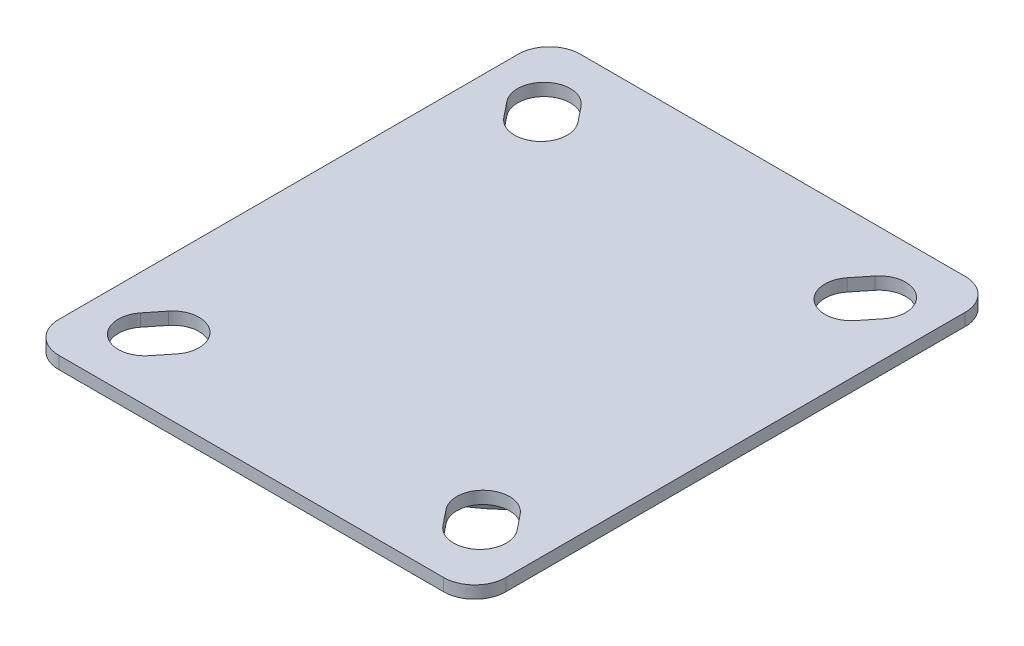
ISO-10303-21;
HEADER;
FILE_DESCRIPTION(('STEP AP214'),'2;1');
FILE_NAME('part.step','',(''),(''),'','','');
FILE_SCHEMA(('AUTOMOTIVE_DESIGN { 1 0 10303 214 1 1 1 1 }'));
ENDSEC;
DATA;
#1=APPLICATION_CONTEXT('core data for automotive mechanical design processes');
#2=APPLICATION_PROTOCOL_DEFINITION('international standard','automotive_design',2000,#1);
#3=PRODUCT_CONTEXT('',#1,'mechanical');
#4=PRODUCT('Part','Part','',(#3));
#5=PRODUCT_RELATED_PRODUCT_CATEGORY('part','',(#4));
#6=PRODUCT_DEFINITION_FORMATION('','',#4);
#7=PRODUCT_DEFINITION_CONTEXT('part definition',#1,'design');
#8=PRODUCT_DEFINITION('design','',#6,#7);
#9=PRODUCT_DEFINITION_SHAPE('','',#8);
#10=(LENGTH_UNIT() NAMED_UNIT(*) SI_UNIT(.MILLI.,.METRE.));
#11=(NAMED_UNIT(*) PLANE_ANGLE_UNIT() SI_UNIT($,.RADIAN.));
#12=(NAMED_UNIT(*) SI_UNIT($,.STERADIAN.) SOLID_ANGLE_UNIT());
#13=UNCERTAINTY_MEASURE_WITH_UNIT(LENGTH_MEASURE(1.E-05),#10,'distance_accuracy_value','');
#14=(GEOMETRIC_REPRESENTATION_CONTEXT(3) GLOBAL_UNCERTAINTY_ASSIGNED_CONTEXT((#13)) GLOBAL_UNIT_ASSIGNED_CONTEXT((#10,
#11,#12)) REPRESENTATION_CONTEXT('',''));
#15=CARTESIAN_POINT('',(0.,0.,0.));
#16=DIRECTION('',(0.,0.,1.));
#17=DIRECTION('',(1.,0.,0.));
#18=AXIS2_PLACEMENT_3D('',#15,#16,#17);
#19=CARTESIAN_POINT('',(31.0000000000009,9.,37.0000000000009));
#20=DIRECTION('',(0.,1.,0.));
#21=DIRECTION('',(-0.707106781186548,0.,-0.707106781186547));
#22=AXIS2_PLACEMENT_3D('',#19,#20,#21);
#23=CYLINDRICAL_SURFACE('',#22,5.);
#24=CARTESIAN_POINT('',(31.0000000000009,7.,37.0000000000009));
#25=DIRECTION('',(0.,1.,0.));
#26=DIRECTION('',(1.,0.,0.));
#27=AXIS2_PLACEMENT_3D('',#24,#25,#26);
#28=CIRCLE('',#27,5.);
#29=CARTESIAN_POINT('',(31.,7.,42.));
#30=VERTEX_POINT('',#29);
#31=CARTESIAN_POINT('',(36.,7.,37.));
#32=VERTEX_POINT('',#31);
#33=EDGE_CURVE('E11',#30,#32,#28,.T.);
#34=ORIENTED_EDGE('',*,*,#33,.T.);
#35=DIRECTION('',(0.,-1.,0.));
#36=VECTOR('',#35,1.);
#37=CARTESIAN_POINT('',(36.,9.,37.));
#38=LINE('',#37,#36);
#39=CARTESIAN_POINT('',(36.,9.,37.));
#40=VERTEX_POINT('',#39);
#41=EDGE_CURVE('E25',#40,#32,#38,.T.);
#42=ORIENTED_EDGE('',*,*,#41,.F.);
#43=CARTESIAN_POINT('',(31.0000000000009,9.,37.0000000000009));
#44=DIRECTION('',(0.,1.,0.));
#45=DIRECTION('',(1.,0.,0.));
#46=AXIS2_PLACEMENT_3D('',#43,#44,#45);
#47=CIRCLE('',#46,5.);
#48=CARTESIAN_POINT('',(31.,9.,42.));
#49=VERTEX_POINT('',#48);
#50=EDGE_CURVE('E538',#49,#40,#47,.T.);
#51=ORIENTED_EDGE('',*,*,#50,.F.);
#52=DIRECTION('',(0.,-1.,0.));
#53=VECTOR('',#52,1.);
#54=CARTESIAN_POINT('',(31.,9.,42.));
#55=LINE('',#54,#53);
#56=EDGE_CURVE('E534',#49,#30,#55,.T.);
#57=ORIENTED_EDGE('',*,*,#56,.T.);
#58=EDGE_LOOP('',(#34,#42,#51,#57));
#59=FACE_BOUND('',#58,.T.);
#60=ADVANCED_FACE('F17',(#59),#23,.T.);
#61=CARTESIAN_POINT('',(-31.,9.,42.));
#62=DIRECTION('',(0.,0.,-1.));
#63=DIRECTION('',(-1.,0.,0.));
#64=AXIS2_PLACEMENT_3D('',#61,#62,#63);
#65=PLANE('',#64);
#66=DIRECTION('',(1.,0.,0.));
#67=VECTOR('',#66,1.);
#68=CARTESIAN_POINT('',(-31.,7.,42.));
#69=LINE('',#68,#67);
#70=CARTESIAN_POINT('',(-31.,7.,42.));
#71=VERTEX_POINT('',#70);
#72=EDGE_CURVE('E529',#71,#30,#69,.T.);
#73=ORIENTED_EDGE('',*,*,#72,.T.);
#74=ORIENTED_EDGE('',*,*,#56,.F.);
#75=DIRECTION('',(1.,0.,0.));
#76=VECTOR('',#75,1.);
#77=CARTESIAN_POINT('',(-31.,9.,42.));
#78=LINE('',#77,#76);
#79=CARTESIAN_POINT('',(-31.,9.,42.));
#80=VERTEX_POINT('',#79);
#81=EDGE_CURVE('E524',#80,#49,#78,.T.);
#82=ORIENTED_EDGE('',*,*,#81,.F.);
#83=DIRECTION('',(0.,-1.,0.));
#84=VECTOR('',#83,1.);
#85=CARTESIAN_POINT('',(-31.,9.,42.));
#86=LINE('',#85,#84);
#87=EDGE_CURVE('E520',#80,#71,#86,.T.);
#88=ORIENTED_EDGE('',*,*,#87,.T.);
#89=EDGE_LOOP('',(#73,#74,#82,#88));
#90=FACE_BOUND('',#89,.T.);
#91=ADVANCED_FACE('F564',(#90),#65,.F.);
#92=CARTESIAN_POINT('',(-31.0000000000009,9.,37.0000000000009));
#93=DIRECTION('',(0.,1.,0.));
#94=DIRECTION('',(0.707106781186548,0.,-0.707106781186547));
#95=AXIS2_PLACEMENT_3D('',#92,#93,#94);
#96=CYLINDRICAL_SURFACE('',#95,5.);
#97=CARTESIAN_POINT('',(-31.0000000000009,7.,37.0000000000009));
#98=DIRECTION('',(0.,1.,0.));
#99=DIRECTION('',(1.,0.,0.));
#100=AXIS2_PLACEMENT_3D('',#97,#98,#99);
#101=CIRCLE('',#100,5.);
#102=CARTESIAN_POINT('',(-36.,7.,37.));
#103=VERTEX_POINT('',#102);
#104=EDGE_CURVE('E515',#103,#71,#101,.T.);
#105=ORIENTED_EDGE('',*,*,#104,.T.);
#106=ORIENTED_EDGE('',*,*,#87,.F.);
#107=CARTESIAN_POINT('',(-31.0000000000009,9.,37.0000000000009));
#108=DIRECTION('',(0.,1.,0.));
#109=DIRECTION('',(1.,0.,0.));
#110=AXIS2_PLACEMENT_3D('',#107,#108,#109);
#111=CIRCLE('',#110,5.);
#112=CARTESIAN_POINT('',(-36.,9.,37.));
#113=VERTEX_POINT('',#112);
#114=EDGE_CURVE('E510',#113,#80,#111,.T.);
#115=ORIENTED_EDGE('',*,*,#114,.F.);
#116=DIRECTION('',(0.,-1.,0.));
#117=VECTOR('',#116,1.);
#118=CARTESIAN_POINT('',(-36.,9.,37.));
#119=LINE('',#118,#117);
#120=EDGE_CURVE('E506',#113,#103,#119,.T.);
#121=ORIENTED_EDGE('',*,*,#120,.T.);
#122=EDGE_LOOP('',(#105,#106,#115,#121));
#123=FACE_BOUND('',#122,.T.);
#124=ADVANCED_FACE('F569',(#123),#96,.T.);
#125=CARTESIAN_POINT('',(-36.,9.,-37.));
#126=DIRECTION('',(1.,0.,0.));
#127=DIRECTION('',(0.,0.,-1.));
#128=AXIS2_PLACEMENT_3D('',#125,#126,#127);
#129=PLANE('',#128);
#130=DIRECTION('',(0.,0.,1.));
#131=VECTOR('',#130,1.);
#132=CARTESIAN_POINT('',(-36.,7.,-37.));
#133=LINE('',#132,#131);
#134=CARTESIAN_POINT('',(-36.,7.,-37.));
#135=VERTEX_POINT('',#134);
#136=EDGE_CURVE('E501',#135,#103,#133,.T.);
#137=ORIENTED_EDGE('',*,*,#136,.T.);
#138=ORIENTED_EDGE('',*,*,#120,.F.);
#139=DIRECTION('',(0.,0.,1.));
#140=VECTOR('',#139,1.);
#141=CARTESIAN_POINT('',(-36.,9.,-37.));
#142=LINE('',#141,#140);
#143=CARTESIAN_POINT('',(-36.,9.,-37.));
#144=VERTEX_POINT('',#143);
#145=EDGE_CURVE('E496',#144,#113,#142,.T.);
#146=ORIENTED_EDGE('',*,*,#145,.F.);
#147=DIRECTION('',(0.,-1.,0.));
#148=VECTOR('',#147,1.);
#149=CARTESIAN_POINT('',(-36.,9.,-37.));
#150=LINE('',#149,#148);
#151=EDGE_CURVE('E492',#144,#135,#150,.T.);
#152=ORIENTED_EDGE('',*,*,#151,.T.);
#153=EDGE_LOOP('',(#137,#138,#146,#152));
#154=FACE_BOUND('',#153,.T.);
#155=ADVANCED_FACE('F572',(#154),#129,.F.);
#156=CARTESIAN_POINT('',(-31.0000000000009,9.,-37.0000000000009));
#157=DIRECTION('',(0.,1.,0.));
#158=DIRECTION('',(0.707106781186675,0.,0.70710678118642));
#159=AXIS2_PLACEMENT_3D('',#156,#157,#158);
#160=CYLINDRICAL_SURFACE('',#159,5.);
#161=CARTESIAN_POINT('',(-31.0000000000009,7.,-37.0000000000009));
#162=DIRECTION('',(0.,1.,0.));
#163=DIRECTION('',(1.,0.,0.));
#164=AXIS2_PLACEMENT_3D('',#161,#162,#163);
#165=CIRCLE('',#164,5.);
#166=CARTESIAN_POINT('',(-31.,7.,-42.));
#167=VERTEX_POINT('',#166);
#168=EDGE_CURVE('E487',#167,#135,#165,.T.);
#169=ORIENTED_EDGE('',*,*,#168,.T.);
#170=ORIENTED_EDGE('',*,*,#151,.F.);
#171=CARTESIAN_POINT('',(-31.0000000000009,9.,-37.0000000000009));
#172=DIRECTION('',(0.,1.,0.));
#173=DIRECTION('',(1.,0.,0.));
#174=AXIS2_PLACEMENT_3D('',#171,#172,#173);
#175=CIRCLE('',#174,5.);
#176=CARTESIAN_POINT('',(-31.,9.,-42.));
#177=VERTEX_POINT('',#176);
#178=EDGE_CURVE('E482',#177,#144,#175,.T.);
#179=ORIENTED_EDGE('',*,*,#178,.F.);
#180=DIRECTION('',(0.,-1.,0.));
#181=VECTOR('',#180,1.);
#182=CARTESIAN_POINT('',(-31.,9.,-42.));
#183=LINE('',#182,#181);
#184=EDGE_CURVE('E478',#177,#167,#183,.T.);
#185=ORIENTED_EDGE('',*,*,#184,.T.);
#186=EDGE_LOOP('',(#169,#170,#179,#185));
#187=FACE_BOUND('',#186,.T.);
#188=ADVANCED_FACE('F575',(#187),#160,.T.);
#189=CARTESIAN_POINT('',(31.,9.,-42.));
#190=DIRECTION('',(0.,0.,1.));
#191=DIRECTION('',(1.,0.,0.));
#192=AXIS2_PLACEMENT_3D('',#189,#190,#191);
#193=PLANE('',#192);
#194=DIRECTION('',(-1.,0.,0.));
#195=VECTOR('',#194,1.);
#196=CARTESIAN_POINT('',(31.,7.,-42.));
#197=LINE('',#196,#195);
#198=CARTESIAN_POINT('',(31.,7.,-42.));
#199=VERTEX_POINT('',#198);
#200=EDGE_CURVE('E473',#199,#167,#197,.T.);
#201=ORIENTED_EDGE('',*,*,#200,.T.);
#202=ORIENTED_EDGE('',*,*,#184,.F.);
#203=DIRECTION('',(-1.,0.,0.));
#204=VECTOR('',#203,1.);
#205=CARTESIAN_POINT('',(31.,9.,-42.));
#206=LINE('',#205,#204);
#207=CARTESIAN_POINT('',(31.,9.,-42.));
#208=VERTEX_POINT('',#207);
#209=EDGE_CURVE('E468',#208,#177,#206,.T.);
#210=ORIENTED_EDGE('',*,*,#209,.F.);
#211=DIRECTION('',(0.,-1.,0.));
#212=VECTOR('',#211,1.);
#213=CARTESIAN_POINT('',(31.,9.,-42.));
#214=LINE('',#213,#212);
#215=EDGE_CURVE('E464',#208,#199,#214,.T.);
#216=ORIENTED_EDGE('',*,*,#215,.T.);
#217=EDGE_LOOP('',(#201,#202,#210,#216));
#218=FACE_BOUND('',#217,.T.);
#219=ADVANCED_FACE('F578',(#218),#193,.F.);
#220=CARTESIAN_POINT('',(31.0000000000009,9.,-37.0000000000009));
#221=DIRECTION('',(0.,1.,0.));
#222=DIRECTION('',(-0.707106781186548,0.,0.707106781186547));
#223=AXIS2_PLACEMENT_3D('',#220,#221,#222);
#224=CYLINDRICAL_SURFACE('',#223,5.);
#225=CARTESIAN_POINT('',(31.0000000000009,7.,-37.0000000000009));
#226=DIRECTION('',(0.,1.,0.));
#227=DIRECTION('',(1.,0.,0.));
#228=AXIS2_PLACEMENT_3D('',#225,#226,#227);
#229=CIRCLE('',#228,5.);
#230=CARTESIAN_POINT('',(36.,7.,-37.));
#231=VERTEX_POINT('',#230);
#232=EDGE_CURVE('E459',#231,#199,#229,.T.);
#233=ORIENTED_EDGE('',*,*,#232,.T.);
#234=ORIENTED_EDGE('',*,*,#215,.F.);
#235=CARTESIAN_POINT('',(31.0000000000009,9.,-37.0000000000009));
#236=DIRECTION('',(0.,1.,0.));
#237=DIRECTION('',(1.,0.,0.));
#238=AXIS2_PLACEMENT_3D('',#235,#236,#237);
#239=CIRCLE('',#238,5.);
#240=CARTESIAN_POINT('',(36.,9.,-37.));
#241=VERTEX_POINT('',#240);
#242=EDGE_CURVE('E454',#241,#208,#239,.T.);
#243=ORIENTED_EDGE('',*,*,#242,.F.);
#244=DIRECTION('',(0.,-1.,0.));
#245=VECTOR('',#244,1.);
#246=CARTESIAN_POINT('',(36.,9.,-37.));
#247=LINE('',#246,#245);
#248=EDGE_CURVE('E450',#241,#231,#247,.T.);
#249=ORIENTED_EDGE('',*,*,#248,.T.);
#250=EDGE_LOOP('',(#233,#234,#243,#249));
#251=FACE_BOUND('',#250,.T.);
#252=ADVANCED_FACE('F559',(#251),#224,.T.);
#253=CARTESIAN_POINT('',(36.,9.,37.));
#254=DIRECTION('',(-1.,0.,0.));
#255=DIRECTION('',(0.,0.,1.));
#256=AXIS2_PLACEMENT_3D('',#253,#254,#255);
#257=PLANE('',#256);
#258=DIRECTION('',(0.,0.,-1.));
#259=VECTOR('',#258,1.);
#260=CARTESIAN_POINT('',(36.,7.,37.));
#261=LINE('',#260,#259);
#262=EDGE_CURVE('E445',#32,#231,#261,.T.);
#263=ORIENTED_EDGE('',*,*,#262,.T.);
#264=ORIENTED_EDGE('',*,*,#248,.F.);
#265=DIRECTION('',(0.,0.,-1.));
#266=VECTOR('',#265,1.);
#267=CARTESIAN_POINT('',(36.,9.,37.));
#268=LINE('',#267,#266);
#269=EDGE_CURVE('E440',#40,#241,#268,.T.);
#270=ORIENTED_EDGE('',*,*,#269,.F.);
#271=ORIENTED_EDGE('',*,*,#41,.T.);
#272=EDGE_LOOP('',(#263,#264,#270,#271));
#273=FACE_BOUND('',#272,.T.);
#274=ADVANCED_FACE('F549',(#273),#257,.F.);
#275=CARTESIAN_POINT('',(-31.0000000000009,9.,-37.0000000000009));
#276=DIRECTION('',(0.,1.,0.));
#277=DIRECTION('',(0.,0.,1.));
#278=AXIS2_PLACEMENT_3D('',#275,#276,#277);
#279=PLANE('',#278);
#280=CARTESIAN_POINT('',(-27.,9.,32.15));
#281=DIRECTION('',(0.,1.,0.));
#282=DIRECTION('',(1.,0.,0.));
#283=AXIS2_PLACEMENT_3D('',#280,#281,#282);
#284=CIRCLE('',#283,4.25);
#285=CARTESIAN_POINT('',(-30.318692440133,9.,29.495046047894));
#286=VERTEX_POINT('',#285);
#287=CARTESIAN_POINT('',(-23.681307559867,9.,34.804953952106));
#288=VERTEX_POINT('',#287);
#289=EDGE_CURVE('E435',#286,#288,#284,.T.);
#290=ORIENTED_EDGE('',*,*,#289,.F.);
#291=DIRECTION('',(-0.624695047554424,0.,0.78086880944303));
#292=VECTOR('',#291,1.);
#293=CARTESIAN_POINT('',(-28.318692440133,9.,26.995046047894));
#294=LINE('',#293,#292);
#295=CARTESIAN_POINT('',(-28.318692440133,9.,26.995046047894));
#296=VERTEX_POINT('',#295);
#297=EDGE_CURVE('E430',#296,#286,#294,.T.);
#298=ORIENTED_EDGE('',*,*,#297,.F.);
#299=CARTESIAN_POINT('',(-25.,9.,29.65));
#300=DIRECTION('',(0.,1.,0.));
#301=DIRECTION('',(1.,0.,0.));
#302=AXIS2_PLACEMENT_3D('',#299,#300,#301);
#303=CIRCLE('',#302,4.25);
#304=CARTESIAN_POINT('',(-21.681307559867,9.,32.304953952106));
#305=VERTEX_POINT('',#304);
#306=EDGE_CURVE('E425',#305,#296,#303,.T.);
#307=ORIENTED_EDGE('',*,*,#306,.F.);
#308=DIRECTION('',(0.624695047554424,0.,-0.78086880944303));
#309=VECTOR('',#308,1.);
#310=CARTESIAN_POINT('',(-23.681307559867,9.,34.804953952106));
#311=LINE('',#310,#309);
#312=EDGE_CURVE('E420',#288,#305,#311,.T.);
#313=ORIENTED_EDGE('',*,*,#312,.F.);
#314=EDGE_LOOP('',(#290,#298,#307,#313));
#315=FACE_BOUND('',#314,.T.);
#316=CARTESIAN_POINT('',(-27.0000000526578,9.,-32.1500000658222));
#317=DIRECTION('',(0.,1.,0.));
#318=DIRECTION('',(1.,0.,0.));
#319=AXIS2_PLACEMENT_3D('',#316,#317,#318);
#320=CIRCLE('',#319,4.25);
#321=CARTESIAN_POINT('',(-23.681307559867,9.,-34.804953952106));
#322=VERTEX_POINT('',#321);
#323=CARTESIAN_POINT('',(-30.318692440133,9.,-29.495046047894));
#324=VERTEX_POINT('',#323);
#325=EDGE_CURVE('E415',#322,#324,#320,.T.);
#326=ORIENTED_EDGE('',*,*,#325,.F.);
#327=DIRECTION('',(-0.624695047554424,0.,-0.78086880944303));
#328=VECTOR('',#327,1.);
#329=CARTESIAN_POINT('',(-21.681307559867,9.,-32.304953952106));
#330=LINE('',#329,#328);
#331=CARTESIAN_POINT('',(-21.681307559867,9.,-32.304953952106));
#332=VERTEX_POINT('',#331);
#333=EDGE_CURVE('E410',#332,#322,#330,.T.);
#334=ORIENTED_EDGE('',*,*,#333,.F.);
#335=CARTESIAN_POINT('',(-25.0000000526578,9.,-29.6500000658222));
#336=DIRECTION('',(0.,1.,0.));
#337=DIRECTION('',(1.,0.,0.));
#338=AXIS2_PLACEMENT_3D('',#335,#336,#337);
#339=CIRCLE('',#338,4.25);
#340=CARTESIAN_POINT('',(-28.318692440133,9.,-26.995046047894));
#341=VERTEX_POINT('',#340);
#342=EDGE_CURVE('E405',#341,#332,#339,.T.);
#343=ORIENTED_EDGE('',*,*,#342,.F.);
#344=DIRECTION('',(0.624695047554424,0.,0.78086880944303));
#345=VECTOR('',#344,1.);
#346=CARTESIAN_POINT('',(-30.318692440133,9.,-29.495046047894));
#347=LINE('',#346,#345);
#348=EDGE_CURVE('E400',#324,#341,#347,.T.);
#349=ORIENTED_EDGE('',*,*,#348,.F.);
#350=EDGE_LOOP('',(#326,#334,#343,#349));
#351=FACE_BOUND('',#350,.T.);
#352=CARTESIAN_POINT('',(25.,9.,29.65));
#353=DIRECTION('',(0.,1.,0.));
#354=DIRECTION('',(1.,0.,0.));
#355=AXIS2_PLACEMENT_3D('',#352,#353,#354);
#356=CIRCLE('',#355,4.25);
#357=CARTESIAN_POINT('',(28.318692440133,9.,26.995046047894));
#358=VERTEX_POINT('',#357);
#359=CARTESIAN_POINT('',(21.681307559867,9.,32.304953952106));
#360=VERTEX_POINT('',#359);
#361=EDGE_CURVE('E395',#358,#360,#356,.T.);
#362=ORIENTED_EDGE('',*,*,#361,.F.);
#363=DIRECTION('',(-0.624695047554424,0.,-0.78086880944303));
#364=VECTOR('',#363,1.);
#365=CARTESIAN_POINT('',(30.318692440133,9.,29.495046047894));
#366=LINE('',#365,#364);
#367=CARTESIAN_POINT('',(30.318692440133,9.,29.495046047894));
#368=VERTEX_POINT('',#367);
#369=EDGE_CURVE('E390',#368,#358,#366,.T.);
#370=ORIENTED_EDGE('',*,*,#369,.F.);
#371=CARTESIAN_POINT('',(27.,9.,32.15));
#372=DIRECTION('',(0.,1.,0.));
#373=DIRECTION('',(1.,0.,0.));
#374=AXIS2_PLACEMENT_3D('',#371,#372,#373);
#375=CIRCLE('',#374,4.25);
#376=CARTESIAN_POINT('',(23.681307559867,9.,34.804953952106));
#377=VERTEX_POINT('',#376);
#378=EDGE_CURVE('E385',#377,#368,#375,.T.);
#379=ORIENTED_EDGE('',*,*,#378,.F.);
#380=DIRECTION('',(0.624695047554424,0.,0.78086880944303));
#381=VECTOR('',#380,1.);
#382=CARTESIAN_POINT('',(21.681307559867,9.,32.304953952106));
#383=LINE('',#382,#381);
#384=EDGE_CURVE('E380',#360,#377,#383,.T.);
#385=ORIENTED_EDGE('',*,*,#384,.F.);
#386=EDGE_LOOP('',(#362,#370,#379,#385));
#387=FACE_BOUND('',#386,.T.);
#388=CARTESIAN_POINT('',(25.,9.,-29.65));
#389=DIRECTION('',(0.,1.,0.));
#390=DIRECTION('',(1.,0.,0.));
#391=AXIS2_PLACEMENT_3D('',#388,#389,#390);
#392=CIRCLE('',#391,4.25);
#393=CARTESIAN_POINT('',(21.681307559867,9.,-32.304953952106));
#394=VERTEX_POINT('',#393);
#395=CARTESIAN_POINT('',(28.318692440133,9.,-26.995046047894));
#396=VERTEX_POINT('',#395);
#397=EDGE_CURVE('E375',#394,#396,#392,.T.);
#398=ORIENTED_EDGE('',*,*,#397,.F.);
#399=DIRECTION('',(-0.624695047554424,0.,0.78086880944303));
#400=VECTOR('',#399,1.);
#401=CARTESIAN_POINT('',(23.681307559867,9.,-34.804953952106));
#402=LINE('',#401,#400);
#403=CARTESIAN_POINT('',(23.681307559867,9.,-34.804953952106));
#404=VERTEX_POINT('',#403);
#405=EDGE_CURVE('E370',#404,#394,#402,.T.);
#406=ORIENTED_EDGE('',*,*,#405,.F.);
#407=CARTESIAN_POINT('',(27.,9.,-32.15));
#408=DIRECTION('',(0.,1.,0.));
#409=DIRECTION('',(1.,0.,0.));
#410=AXIS2_PLACEMENT_3D('',#407,#408,#409);
#411=CIRCLE('',#410,4.25);
#412=CARTESIAN_POINT('',(30.318692440133,9.,-29.495046047894));
#413=VERTEX_POINT('',#412);
#414=EDGE_CURVE('E365',#413,#404,#411,.T.);
#415=ORIENTED_EDGE('',*,*,#414,.F.);
#416=DIRECTION('',(0.624695047554424,0.,-0.78086880944303));
#417=VECTOR('',#416,1.);
#418=CARTESIAN_POINT('',(28.318692440133,9.,-26.995046047894));
#419=LINE('',#418,#417);
#420=EDGE_CURVE('E360',#396,#413,#419,.T.);
#421=ORIENTED_EDGE('',*,*,#420,.F.);
#422=EDGE_LOOP('',(#398,#406,#415,#421));
#423=FACE_BOUND('',#422,.T.);
#424=ORIENTED_EDGE('',*,*,#178,.T.);
#425=ORIENTED_EDGE('',*,*,#145,.T.);
#426=ORIENTED_EDGE('',*,*,#114,.T.);
#427=ORIENTED_EDGE('',*,*,#81,.T.);
#428=ORIENTED_EDGE('',*,*,#50,.T.);
#429=ORIENTED_EDGE('',*,*,#269,.T.);
#430=ORIENTED_EDGE('',*,*,#242,.T.);
#431=ORIENTED_EDGE('',*,*,#209,.T.);
#432=EDGE_LOOP('',(#424,#425,#426,#427,#428,#429,#430,#431));
#433=FACE_BOUND('',#432,.T.);
#434=ADVANCED_FACE('F561',(#315,#351,#387,#423,#433),#279,.T.);
#435=CARTESIAN_POINT('',(28.318692440133,9.,-26.995046047894));
#436=DIRECTION('',(-0.78086880944303,0.,-0.624695047554424));
#437=DIRECTION('',(-0.624695047554424,0.,0.78086880944303));
#438=AXIS2_PLACEMENT_3D('',#435,#436,#437);
#439=PLANE('',#438);
#440=DIRECTION('',(0.624695047554424,0.,-0.78086880944303));
#441=VECTOR('',#440,1.);
#442=CARTESIAN_POINT('',(28.318692440133,7.,-26.995046047894));
#443=LINE('',#442,#441);
#444=CARTESIAN_POINT('',(28.318692440133,7.,-26.995046047894));
#445=VERTEX_POINT('',#444);
#446=CARTESIAN_POINT('',(30.318692440133,7.,-29.495046047894));
#447=VERTEX_POINT('',#446);
#448=EDGE_CURVE('E355',#445,#447,#443,.T.);
#449=ORIENTED_EDGE('',*,*,#448,.F.);
#450=DIRECTION('',(0.,-1.,0.));
#451=VECTOR('',#450,1.);
#452=CARTESIAN_POINT('',(28.318692440133,9.,-26.995046047894));
#453=LINE('',#452,#451);
#454=EDGE_CURVE('E350',#396,#445,#453,.T.);
#455=ORIENTED_EDGE('',*,*,#454,.F.);
#456=ORIENTED_EDGE('',*,*,#420,.T.);
#457=DIRECTION('',(0.,-1.,0.));
#458=VECTOR('',#457,1.);
#459=CARTESIAN_POINT('',(30.318692440133,9.,-29.495046047894));
#460=LINE('',#459,#458);
#461=EDGE_CURVE('E346',#413,#447,#460,.T.);
#462=ORIENTED_EDGE('',*,*,#461,.T.);
#463=EDGE_LOOP('',(#449,#455,#456,#462));
#464=FACE_BOUND('',#463,.T.);
#465=ADVANCED_FACE('F637',(#464),#439,.T.);
#466=CARTESIAN_POINT('',(27.,9.,-32.15));
#467=DIRECTION('',(0.,1.,0.));
#468=DIRECTION('',(-0.624695047554367,0.,0.780868809443076));
#469=AXIS2_PLACEMENT_3D('',#466,#467,#468);
#470=CYLINDRICAL_SURFACE('',#469,4.25);
#471=DIRECTION('',(0.,-1.,0.));
#472=VECTOR('',#471,1.);
#473=CARTESIAN_POINT('',(23.681307559867,9.,-34.804953952106));
#474=LINE('',#473,#472);
#475=CARTESIAN_POINT('',(23.681307559867,7.,-34.804953952106));
#476=VERTEX_POINT('',#475);
#477=EDGE_CURVE('E342',#404,#476,#474,.T.);
#478=ORIENTED_EDGE('',*,*,#477,.T.);
#479=CARTESIAN_POINT('',(27.,7.,-32.15));
#480=DIRECTION('',(0.,1.,0.));
#481=DIRECTION('',(1.,0.,0.));
#482=AXIS2_PLACEMENT_3D('',#479,#480,#481);
#483=CIRCLE('',#482,4.25);
#484=EDGE_CURVE('E337',#447,#476,#483,.T.);
#485=ORIENTED_EDGE('',*,*,#484,.F.);
#486=ORIENTED_EDGE('',*,*,#461,.F.);
#487=ORIENTED_EDGE('',*,*,#414,.T.);
#488=EDGE_LOOP('',(#478,#485,#486,#487));
#489=FACE_BOUND('',#488,.T.);
#490=ADVANCED_FACE('F647',(#489),#470,.F.);
#491=CARTESIAN_POINT('',(-31.0000000000009,7.,-37.0000000000009));
#492=DIRECTION('',(0.,1.,0.));
#493=DIRECTION('',(0.,0.,1.));
#494=AXIS2_PLACEMENT_3D('',#491,#492,#493);
#495=PLANE('',#494);
#496=CARTESIAN_POINT('',(0.,7.,0.));
#497=DIRECTION('',(0.,1.,0.));
#498=DIRECTION('',(0.,0.,1.));
#499=AXIS2_PLACEMENT_3D('',#496,#497,#498);
#500=CIRCLE('',#499,27.5);
#501=CARTESIAN_POINT('',(0.,7.,27.5));
#502=VERTEX_POINT('',#501);
#503=CARTESIAN_POINT('',(0.,7.,-27.5));
#504=VERTEX_POINT('',#503);
#505=EDGE_CURVE('E333',#502,#504,#500,.T.);
#506=ORIENTED_EDGE('',*,*,#505,.T.);
#507=CARTESIAN_POINT('',(0.,7.,0.));
#508=DIRECTION('',(0.,1.,0.));
#509=DIRECTION('',(0.,0.,1.));
#510=AXIS2_PLACEMENT_3D('',#507,#508,#509);
#511=CIRCLE('',#510,27.5);
#512=EDGE_CURVE('E192',#504,#502,#511,.T.);
#513=ORIENTED_EDGE('',*,*,#512,.T.);
#514=EDGE_LOOP('',(#506,#513));
#515=FACE_BOUND('',#514,.T.);
#516=DIRECTION('',(-0.624695047554424,0.,0.78086880944303));
#517=VECTOR('',#516,1.);
#518=CARTESIAN_POINT('',(-28.318692440133,7.,26.995046047894));
#519=LINE('',#518,#517);
#520=CARTESIAN_POINT('',(-28.318692440133,7.,26.995046047894));
#521=VERTEX_POINT('',#520);
#522=CARTESIAN_POINT('',(-30.318692440133,7.,29.495046047894));
#523=VERTEX_POINT('',#522);
#524=EDGE_CURVE('E326',#521,#523,#519,.T.);
#525=ORIENTED_EDGE('',*,*,#524,.T.);
#526=CARTESIAN_POINT('',(-27.,7.,32.15));
#527=DIRECTION('',(0.,1.,0.));
#528=DIRECTION('',(1.,0.,0.));
#529=AXIS2_PLACEMENT_3D('',#526,#527,#528);
#530=CIRCLE('',#529,4.25);
#531=CARTESIAN_POINT('',(-23.681307559867,7.,34.804953952106));
#532=VERTEX_POINT('',#531);
#533=EDGE_CURVE('E322',#523,#532,#530,.T.);
#534=ORIENTED_EDGE('',*,*,#533,.T.);
#535=DIRECTION('',(0.624695047554424,0.,-0.78086880944303));
#536=VECTOR('',#535,1.);
#537=CARTESIAN_POINT('',(-23.681307559867,7.,34.804953952106));
#538=LINE('',#537,#536);
#539=CARTESIAN_POINT('',(-21.681307559867,7.,32.304953952106));
#540=VERTEX_POINT('',#539);
#541=EDGE_CURVE('E318',#532,#540,#538,.T.);
#542=ORIENTED_EDGE('',*,*,#541,.T.);
#543=CARTESIAN_POINT('',(-25.,7.,29.65));
#544=DIRECTION('',(0.,1.,0.));
#545=DIRECTION('',(1.,0.,0.));
#546=AXIS2_PLACEMENT_3D('',#543,#544,#545);
#547=CIRCLE('',#546,4.25);
#548=EDGE_CURVE('E314',#540,#521,#547,.T.);
#549=ORIENTED_EDGE('',*,*,#548,.T.);
#550=EDGE_LOOP('',(#525,#534,#542,#549));
#551=FACE_BOUND('',#550,.T.);
#552=DIRECTION('',(-0.624695047554424,0.,-0.78086880944303));
#553=VECTOR('',#552,1.);
#554=CARTESIAN_POINT('',(-21.681307559867,7.,-32.304953952106));
#555=LINE('',#554,#553);
#556=CARTESIAN_POINT('',(-21.681307559867,7.,-32.304953952106));
#557=VERTEX_POINT('',#556);
#558=CARTESIAN_POINT('',(-23.681307559867,7.,-34.804953952106));
#559=VERTEX_POINT('',#558);
#560=EDGE_CURVE('E310',#557,#559,#555,.T.);
#561=ORIENTED_EDGE('',*,*,#560,.T.);
#562=CARTESIAN_POINT('',(-27.0000000526578,7.,-32.1500000658222));
#563=DIRECTION('',(0.,1.,0.));
#564=DIRECTION('',(1.,0.,0.));
#565=AXIS2_PLACEMENT_3D('',#562,#563,#564);
#566=CIRCLE('',#565,4.25);
#567=CARTESIAN_POINT('',(-30.318692440133,7.,-29.495046047894));
#568=VERTEX_POINT('',#567);
#569=EDGE_CURVE('E306',#559,#568,#566,.T.);
#570=ORIENTED_EDGE('',*,*,#569,.T.);
#571=DIRECTION('',(0.624695047554424,0.,0.78086880944303));
#572=VECTOR('',#571,1.);
#573=CARTESIAN_POINT('',(-30.318692440133,7.,-29.495046047894));
#574=LINE('',#573,#572);
#575=CARTESIAN_POINT('',(-28.318692440133,7.,-26.995046047894));
#576=VERTEX_POINT('',#575);
#577=EDGE_CURVE('E302',#568,#576,#574,.T.);
#578=ORIENTED_EDGE('',*,*,#577,.T.);
#579=CARTESIAN_POINT('',(-25.0000000526578,7.,-29.6500000658222));
#580=DIRECTION('',(0.,1.,0.));
#581=DIRECTION('',(1.,0.,0.));
#582=AXIS2_PLACEMENT_3D('',#579,#580,#581);
#583=CIRCLE('',#582,4.25);
#584=EDGE_CURVE('E298',#576,#557,#583,.T.);
#585=ORIENTED_EDGE('',*,*,#584,.T.);
#586=EDGE_LOOP('',(#561,#570,#578,#585));
#587=FACE_BOUND('',#586,.T.);
#588=DIRECTION('',(-0.624695047554424,0.,-0.78086880944303));
#589=VECTOR('',#588,1.);
#590=CARTESIAN_POINT('',(30.318692440133,7.,29.495046047894));
#591=LINE('',#590,#589);
#592=CARTESIAN_POINT('',(30.318692440133,7.,29.495046047894));
#593=VERTEX_POINT('',#592);
#594=CARTESIAN_POINT('',(28.318692440133,7.,26.995046047894));
#595=VERTEX_POINT('',#594);
#596=EDGE_CURVE('E294',#593,#595,#591,.T.);
#597=ORIENTED_EDGE('',*,*,#596,.T.);
#598=CARTESIAN_POINT('',(25.,7.,29.65));
#599=DIRECTION('',(0.,1.,0.));
#600=DIRECTION('',(1.,0.,0.));
#601=AXIS2_PLACEMENT_3D('',#598,#599,#600);
#602=CIRCLE('',#601,4.25);
#603=CARTESIAN_POINT('',(21.681307559867,7.,32.304953952106));
#604=VERTEX_POINT('',#603);
#605=EDGE_CURVE('E290',#595,#604,#602,.T.);
#606=ORIENTED_EDGE('',*,*,#605,.T.);
#607=DIRECTION('',(0.624695047554424,0.,0.78086880944303));
#608=VECTOR('',#607,1.);
#609=CARTESIAN_POINT('',(21.681307559867,7.,32.304953952106));
#610=LINE('',#609,#608);
#611=CARTESIAN_POINT('',(23.681307559867,7.,34.804953952106));
#612=VERTEX_POINT('',#611);
#613=EDGE_CURVE('E286',#604,#612,#610,.T.);
#614=ORIENTED_EDGE('',*,*,#613,.T.);
#615=CARTESIAN_POINT('',(27.,7.,32.15));
#616=DIRECTION('',(0.,1.,0.));
#617=DIRECTION('',(1.,0.,0.));
#618=AXIS2_PLACEMENT_3D('',#615,#616,#617);
#619=CIRCLE('',#618,4.25);
#620=EDGE_CURVE('E282',#612,#593,#619,.T.);
#621=ORIENTED_EDGE('',*,*,#620,.T.);
#622=EDGE_LOOP('',(#597,#606,#614,#621));
#623=FACE_BOUND('',#622,.T.);
#624=DIRECTION('',(-0.624695047554424,0.,0.78086880944303));
#625=VECTOR('',#624,1.);
#626=CARTESIAN_POINT('',(23.681307559867,7.,-34.804953952106));
#627=LINE('',#626,#625);
#628=CARTESIAN_POINT('',(21.681307559867,7.,-32.304953952106));
#629=VERTEX_POINT('',#628);
#630=EDGE_CURVE('E278',#476,#629,#627,.T.);
#631=ORIENTED_EDGE('',*,*,#630,.T.);
#632=CARTESIAN_POINT('',(25.,7.,-29.65));
#633=DIRECTION('',(0.,1.,0.));
#634=DIRECTION('',(1.,0.,0.));
#635=AXIS2_PLACEMENT_3D('',#632,#633,#634);
#636=CIRCLE('',#635,4.25);
#637=EDGE_CURVE('E273',#629,#445,#636,.T.);
#638=ORIENTED_EDGE('',*,*,#637,.T.);
#639=ORIENTED_EDGE('',*,*,#448,.T.);
#640=ORIENTED_EDGE('',*,*,#484,.T.);
#641=EDGE_LOOP('',(#631,#638,#639,#640));
#642=FACE_BOUND('',#641,.T.);
#643=ORIENTED_EDGE('',*,*,#168,.F.);
#644=ORIENTED_EDGE('',*,*,#200,.F.);
#645=ORIENTED_EDGE('',*,*,#232,.F.);
#646=ORIENTED_EDGE('',*,*,#262,.F.);
#647=ORIENTED_EDGE('',*,*,#33,.F.);
#648=ORIENTED_EDGE('',*,*,#72,.F.);
#649=ORIENTED_EDGE('',*,*,#104,.F.);
#650=ORIENTED_EDGE('',*,*,#136,.F.);
#651=EDGE_LOOP('',(#643,#644,#645,#646,#647,#648,#649,#650));
#652=FACE_BOUND('',#651,.T.);
#653=ADVANCED_FACE('F554',(#515,#551,#587,#623,#642,#652),#495,.F.);
#654=CARTESIAN_POINT('',(25.,9.,-29.65));
#655=DIRECTION('',(0.,1.,0.));
#656=DIRECTION('',(0.624695047554368,0.,-0.780868809443076));
#657=AXIS2_PLACEMENT_3D('',#654,#655,#656);
#658=CYLINDRICAL_SURFACE('',#657,4.25);
#659=ORIENTED_EDGE('',*,*,#454,.T.);
#660=ORIENTED_EDGE('',*,*,#637,.F.);
#661=DIRECTION('',(0.,-1.,0.));
#662=VECTOR('',#661,1.);
#663=CARTESIAN_POINT('',(21.681307559867,9.,-32.304953952106));
#664=LINE('',#663,#662);
#665=EDGE_CURVE('E268',#394,#629,#664,.T.);
#666=ORIENTED_EDGE('',*,*,#665,.F.);
#667=ORIENTED_EDGE('',*,*,#397,.T.);
#668=EDGE_LOOP('',(#659,#660,#666,#667));
#669=FACE_BOUND('',#668,.T.);
#670=ADVANCED_FACE('F666',(#669),#658,.F.);
#671=CARTESIAN_POINT('',(23.681307559867,9.,-34.804953952106));
#672=DIRECTION('',(0.78086880944303,0.,0.624695047554424));
#673=DIRECTION('',(0.624695047554424,0.,-0.78086880944303));
#674=AXIS2_PLACEMENT_3D('',#671,#672,#673);
#675=PLANE('',#674);
#676=ORIENTED_EDGE('',*,*,#630,.F.);
#677=ORIENTED_EDGE('',*,*,#477,.F.);
#678=ORIENTED_EDGE('',*,*,#405,.T.);
#679=ORIENTED_EDGE('',*,*,#665,.T.);
#680=EDGE_LOOP('',(#676,#677,#678,#679));
#681=FACE_BOUND('',#680,.T.);
#682=ADVANCED_FACE('F676',(#681),#675,.T.);
#683=CARTESIAN_POINT('',(27.,9.,32.15));
#684=DIRECTION('',(0.,1.,0.));
#685=DIRECTION('',(-0.624695047554367,0.,-0.780868809443076));
#686=AXIS2_PLACEMENT_3D('',#683,#684,#685);
#687=CYLINDRICAL_SURFACE('',#686,4.25);
#688=DIRECTION('',(0.,-1.,0.));
#689=VECTOR('',#688,1.);
#690=CARTESIAN_POINT('',(30.318692440133,9.,29.495046047894));
#691=LINE('',#690,#689);
#692=EDGE_CURVE('E263',#368,#593,#691,.T.);
#693=ORIENTED_EDGE('',*,*,#692,.T.);
#694=ORIENTED_EDGE('',*,*,#620,.F.);
#695=DIRECTION('',(0.,-1.,0.));
#696=VECTOR('',#695,1.);
#697=CARTESIAN_POINT('',(23.681307559867,9.,34.804953952106));
#698=LINE('',#697,#696);
#699=EDGE_CURVE('E258',#377,#612,#698,.T.);
#700=ORIENTED_EDGE('',*,*,#699,.F.);
#701=ORIENTED_EDGE('',*,*,#378,.T.);
#702=EDGE_LOOP('',(#693,#694,#700,#701));
#703=FACE_BOUND('',#702,.T.);
#704=ADVANCED_FACE('F686',(#703),#687,.F.);
#705=CARTESIAN_POINT('',(21.681307559867,9.,32.304953952106));
#706=DIRECTION('',(0.78086880944303,0.,-0.624695047554424));
#707=DIRECTION('',(-0.624695047554424,0.,-0.78086880944303));
#708=AXIS2_PLACEMENT_3D('',#705,#706,#707);
#709=PLANE('',#708);
#710=ORIENTED_EDGE('',*,*,#613,.F.);
#711=DIRECTION('',(0.,-1.,0.));
#712=VECTOR('',#711,1.);
#713=CARTESIAN_POINT('',(21.681307559867,9.,32.304953952106));
#714=LINE('',#713,#712);
#715=EDGE_CURVE('E253',#360,#604,#714,.T.);
#716=ORIENTED_EDGE('',*,*,#715,.F.);
#717=ORIENTED_EDGE('',*,*,#384,.T.);
#718=ORIENTED_EDGE('',*,*,#699,.T.);
#719=EDGE_LOOP('',(#710,#716,#717,#718));
#720=FACE_BOUND('',#719,.T.);
#721=ADVANCED_FACE('F696',(#720),#709,.T.);
#722=CARTESIAN_POINT('',(25.,9.,29.65));
#723=DIRECTION('',(0.,1.,0.));
#724=DIRECTION('',(0.624695047554367,0.,0.780868809443076));
#725=AXIS2_PLACEMENT_3D('',#722,#723,#724);
#726=CYLINDRICAL_SURFACE('',#725,4.25);
#727=ORIENTED_EDGE('',*,*,#715,.T.);
#728=ORIENTED_EDGE('',*,*,#605,.F.);
#729=DIRECTION('',(0.,-1.,0.));
#730=VECTOR('',#729,1.);
#731=CARTESIAN_POINT('',(28.318692440133,9.,26.995046047894));
#732=LINE('',#731,#730);
#733=EDGE_CURVE('E248',#358,#595,#732,.T.);
#734=ORIENTED_EDGE('',*,*,#733,.F.);
#735=ORIENTED_EDGE('',*,*,#361,.T.);
#736=EDGE_LOOP('',(#727,#728,#734,#735));
#737=FACE_BOUND('',#736,.T.);
#738=ADVANCED_FACE('F706',(#737),#726,.F.);
#739=CARTESIAN_POINT('',(30.318692440133,9.,29.495046047894));
#740=DIRECTION('',(-0.78086880944303,0.,0.624695047554424));
#741=DIRECTION('',(0.624695047554424,0.,0.78086880944303));
#742=AXIS2_PLACEMENT_3D('',#739,#740,#741);
#743=PLANE('',#742);
#744=ORIENTED_EDGE('',*,*,#596,.F.);
#745=ORIENTED_EDGE('',*,*,#692,.F.);
#746=ORIENTED_EDGE('',*,*,#369,.T.);
#747=ORIENTED_EDGE('',*,*,#733,.T.);
#748=EDGE_LOOP('',(#744,#745,#746,#747));
#749=FACE_BOUND('',#748,.T.);
#750=ADVANCED_FACE('F716',(#749),#743,.T.);
#751=CARTESIAN_POINT('',(-25.0000000526578,9.,-29.6500000658222));
#752=DIRECTION('',(0.,1.,0.));
#753=DIRECTION('',(-0.624695047554366,0.,-0.780868809443077));
#754=AXIS2_PLACEMENT_3D('',#751,#752,#753);
#755=CYLINDRICAL_SURFACE('',#754,4.25);
#756=DIRECTION('',(0.,-1.,0.));
#757=VECTOR('',#756,1.);
#758=CARTESIAN_POINT('',(-21.681307559867,9.,-32.304953952106));
#759=LINE('',#758,#757);
#760=EDGE_CURVE('E243',#332,#557,#759,.T.);
#761=ORIENTED_EDGE('',*,*,#760,.T.);
#762=ORIENTED_EDGE('',*,*,#584,.F.);
#763=DIRECTION('',(0.,-1.,0.));
#764=VECTOR('',#763,1.);
#765=CARTESIAN_POINT('',(-28.318692440133,9.,-26.995046047894));
#766=LINE('',#765,#764);
#767=EDGE_CURVE('E238',#341,#576,#766,.T.);
#768=ORIENTED_EDGE('',*,*,#767,.F.);
#769=ORIENTED_EDGE('',*,*,#342,.T.);
#770=EDGE_LOOP('',(#761,#762,#768,#769));
#771=FACE_BOUND('',#770,.T.);
#772=ADVANCED_FACE('F726',(#771),#755,.F.);
#773=CARTESIAN_POINT('',(-30.318692440133,9.,-29.495046047894));
#774=DIRECTION('',(0.78086880944303,0.,-0.624695047554424));
#775=DIRECTION('',(-0.624695047554424,0.,-0.78086880944303));
#776=AXIS2_PLACEMENT_3D('',#773,#774,#775);
#777=PLANE('',#776);
#778=ORIENTED_EDGE('',*,*,#577,.F.);
#779=DIRECTION('',(0.,-1.,0.));
#780=VECTOR('',#779,1.);
#781=CARTESIAN_POINT('',(-30.318692440133,9.,-29.495046047894));
#782=LINE('',#781,#780);
#783=EDGE_CURVE('E233',#324,#568,#782,.T.);
#784=ORIENTED_EDGE('',*,*,#783,.F.);
#785=ORIENTED_EDGE('',*,*,#348,.T.);
#786=ORIENTED_EDGE('',*,*,#767,.T.);
#787=EDGE_LOOP('',(#778,#784,#785,#786));
#788=FACE_BOUND('',#787,.T.);
#789=ADVANCED_FACE('F736',(#788),#777,.T.);
#790=CARTESIAN_POINT('',(-27.0000000526578,9.,-32.1500000658222));
#791=DIRECTION('',(0.,1.,0.));
#792=DIRECTION('',(0.624695047554367,0.,0.780868809443076));
#793=AXIS2_PLACEMENT_3D('',#790,#791,#792);
#794=CYLINDRICAL_SURFACE('',#793,4.25);
#795=ORIENTED_EDGE('',*,*,#783,.T.);
#796=ORIENTED_EDGE('',*,*,#569,.F.);
#797=DIRECTION('',(0.,-1.,0.));
#798=VECTOR('',#797,1.);
#799=CARTESIAN_POINT('',(-23.681307559867,9.,-34.804953952106));
#800=LINE('',#799,#798);
#801=EDGE_CURVE('E228',#322,#559,#800,.T.);
#802=ORIENTED_EDGE('',*,*,#801,.F.);
#803=ORIENTED_EDGE('',*,*,#325,.T.);
#804=EDGE_LOOP('',(#795,#796,#802,#803));
#805=FACE_BOUND('',#804,.T.);
#806=ADVANCED_FACE('F746',(#805),#794,.F.);
#807=CARTESIAN_POINT('',(-21.681307559867,9.,-32.304953952106));
#808=DIRECTION('',(-0.78086880944303,0.,0.624695047554424));
#809=DIRECTION('',(0.624695047554424,0.,0.78086880944303));
#810=AXIS2_PLACEMENT_3D('',#807,#808,#809);
#811=PLANE('',#810);
#812=ORIENTED_EDGE('',*,*,#560,.F.);
#813=ORIENTED_EDGE('',*,*,#760,.F.);
#814=ORIENTED_EDGE('',*,*,#333,.T.);
#815=ORIENTED_EDGE('',*,*,#801,.T.);
#816=EDGE_LOOP('',(#812,#813,#814,#815));
#817=FACE_BOUND('',#816,.T.);
#818=ADVANCED_FACE('F756',(#817),#811,.T.);
#819=CARTESIAN_POINT('',(-25.,9.,29.65));
#820=DIRECTION('',(0.,1.,0.));
#821=DIRECTION('',(-0.624695047554367,0.,0.780868809443076));
#822=AXIS2_PLACEMENT_3D('',#819,#820,#821);
#823=CYLINDRICAL_SURFACE('',#822,4.25);
#824=DIRECTION('',(0.,-1.,0.));
#825=VECTOR('',#824,1.);
#826=CARTESIAN_POINT('',(-28.318692440133,9.,26.995046047894));
#827=LINE('',#826,#825);
#828=EDGE_CURVE('E223',#296,#521,#827,.T.);
#829=ORIENTED_EDGE('',*,*,#828,.T.);
#830=ORIENTED_EDGE('',*,*,#548,.F.);
#831=DIRECTION('',(0.,-1.,0.));
#832=VECTOR('',#831,1.);
#833=CARTESIAN_POINT('',(-21.681307559867,9.,32.304953952106));
#834=LINE('',#833,#832);
#835=EDGE_CURVE('E218',#305,#540,#834,.T.);
#836=ORIENTED_EDGE('',*,*,#835,.F.);
#837=ORIENTED_EDGE('',*,*,#306,.T.);
#838=EDGE_LOOP('',(#829,#830,#836,#837));
#839=FACE_BOUND('',#838,.T.);
#840=ADVANCED_FACE('F766',(#839),#823,.F.);
#841=CARTESIAN_POINT('',(-23.681307559867,9.,34.804953952106));
#842=DIRECTION('',(-0.78086880944303,0.,-0.624695047554424));
#843=DIRECTION('',(-0.624695047554424,0.,0.78086880944303));
#844=AXIS2_PLACEMENT_3D('',#841,#842,#843);
#845=PLANE('',#844);
#846=ORIENTED_EDGE('',*,*,#541,.F.);
#847=DIRECTION('',(0.,-1.,0.));
#848=VECTOR('',#847,1.);
#849=CARTESIAN_POINT('',(-23.681307559867,9.,34.804953952106));
#850=LINE('',#849,#848);
#851=EDGE_CURVE('E206',#288,#532,#850,.T.);
#852=ORIENTED_EDGE('',*,*,#851,.F.);
#853=ORIENTED_EDGE('',*,*,#312,.T.);
#854=ORIENTED_EDGE('',*,*,#835,.T.);
#855=EDGE_LOOP('',(#846,#852,#853,#854));
#856=FACE_BOUND('',#855,.T.);
#857=ADVANCED_FACE('F776',(#856),#845,.T.);
#858=CARTESIAN_POINT('',(-27.,9.,32.15));
#859=DIRECTION('',(0.,1.,0.));
#860=DIRECTION('',(0.624695047554367,0.,-0.780868809443076));
#861=AXIS2_PLACEMENT_3D('',#858,#859,#860);
#862=CYLINDRICAL_SURFACE('',#861,4.25);
#863=ORIENTED_EDGE('',*,*,#851,.T.);
#864=ORIENTED_EDGE('',*,*,#533,.F.);
#865=DIRECTION('',(0.,-1.,0.));
#866=VECTOR('',#865,1.);
#867=CARTESIAN_POINT('',(-30.318692440133,9.,29.495046047894));
#868=LINE('',#867,#866);
#869=EDGE_CURVE('E203',#286,#523,#868,.T.);
#870=ORIENTED_EDGE('',*,*,#869,.F.);
#871=ORIENTED_EDGE('',*,*,#289,.T.);
#872=EDGE_LOOP('',(#863,#864,#870,#871));
#873=FACE_BOUND('',#872,.T.);
#874=ADVANCED_FACE('F786',(#873),#862,.F.);
#875=CARTESIAN_POINT('',(-28.318692440133,9.,26.995046047894));
#876=DIRECTION('',(0.78086880944303,0.,0.624695047554424));
#877=DIRECTION('',(0.624695047554424,0.,-0.78086880944303));
#878=AXIS2_PLACEMENT_3D('',#875,#876,#877);
#879=PLANE('',#878);
#880=ORIENTED_EDGE('',*,*,#524,.F.);
#881=ORIENTED_EDGE('',*,*,#828,.F.);
#882=ORIENTED_EDGE('',*,*,#297,.T.);
#883=ORIENTED_EDGE('',*,*,#869,.T.);
#884=EDGE_LOOP('',(#880,#881,#882,#883));
#885=FACE_BOUND('',#884,.T.);
#886=ADVANCED_FACE('F796',(#885),#879,.T.);
#887=CARTESIAN_POINT('',(0.,7.,0.));
#888=DIRECTION('',(0.,1.,0.));
#889=DIRECTION('',(1.,0.,0.));
#890=AXIS2_PLACEMENT_3D('',#887,#888,#889);
#891=CONICAL_SURFACE('',#890,27.5,0.278299659);
#892=CARTESIAN_POINT('',(0.,0.,0.));
#893=DIRECTION('',(0.,-1.,0.));
#894=DIRECTION('',(0.,0.,-1.));
#895=AXIS2_PLACEMENT_3D('',#892,#893,#894);
#896=CIRCLE('',#895,25.5);
#897=CARTESIAN_POINT('',(0.,-1.02238217891681E-11,25.5000000000358));
#898=VERTEX_POINT('',#897);
#899=CARTESIAN_POINT('',(0.,0.,-25.5));
#900=VERTEX_POINT('',#899);
#901=EDGE_CURVE('E190',#898,#900,#896,.T.);
#902=ORIENTED_EDGE('',*,*,#901,.F.);
#903=DIRECTION('',(0.,0.961523947642228,0.274721127892463));
#904=VECTOR('',#903,1.);
#905=CARTESIAN_POINT('',(0.,-1.02238217891681E-11,25.5000000000358));
#906=LINE('',#905,#904);
#907=EDGE_CURVE('E195',#898,#502,#906,.T.);
#908=ORIENTED_EDGE('',*,*,#907,.T.);
#909=ORIENTED_EDGE('',*,*,#512,.F.);
#910=DIRECTION('',(0.,0.961523947642228,-0.274721127892463));
#911=VECTOR('',#910,1.);
#912=CARTESIAN_POINT('',(0.,-1.02229336107484E-11,-25.5000000000358));
#913=LINE('',#912,#911);
#914=EDGE_CURVE('E185',#900,#504,#913,.T.);
#915=ORIENTED_EDGE('',*,*,#914,.F.);
#916=EDGE_LOOP('',(#902,#908,#909,#915));
#917=FACE_BOUND('',#916,.T.);
#918=ADVANCED_FACE('F187',(#917),#891,.T.);
#919=CARTESIAN_POINT('',(0.,7.,0.));
#920=DIRECTION('',(0.,1.,0.));
#921=DIRECTION('',(-1.,0.,0.));
#922=AXIS2_PLACEMENT_3D('',#919,#920,#921);
#923=CONICAL_SURFACE('',#922,27.5,0.278299659);
#924=ORIENTED_EDGE('',*,*,#505,.F.);
#925=ORIENTED_EDGE('',*,*,#907,.F.);
#926=CARTESIAN_POINT('',(0.,0.,0.));
#927=DIRECTION('',(0.,-1.,0.));
#928=DIRECTION('',(0.,0.,-1.));
#929=AXIS2_PLACEMENT_3D('',#926,#927,#928);
#930=CIRCLE('',#929,25.5);
#931=EDGE_CURVE('E196',#900,#898,#930,.T.);
#932=ORIENTED_EDGE('',*,*,#931,.F.);
#933=ORIENTED_EDGE('',*,*,#914,.T.);
#934=EDGE_LOOP('',(#924,#925,#932,#933));
#935=FACE_BOUND('',#934,.T.);
#936=ADVANCED_FACE('F199',(#935),#923,.T.);
#937=CARTESIAN_POINT('',(25.5,0.,0.));
#938=DIRECTION('',(0.,1.,0.));
#939=DIRECTION('',(0.,0.,1.));
#940=AXIS2_PLACEMENT_3D('',#937,#938,#939);
#941=PLANE('',#940);
#942=ORIENTED_EDGE('',*,*,#931,.T.);
#943=ORIENTED_EDGE('',*,*,#901,.T.);
#944=EDGE_LOOP('',(#942,#943));
#945=FACE_BOUND('',#944,.T.);
#946=ADVANCED_FACE('F202',(#945),#941,.F.);
#947=CLOSED_SHELL('',(#60,#91,#124,#155,#188,#219,#252,#274,#434,#465,#490,#653,#670,#682,#704,
#721,#738,#750,#772,#789,#806,#818,#840,#857,#874,#886,#918,#936,#946));
#948=MANIFOLD_SOLID_BREP('B1',#947);
#949=ADVANCED_BREP_SHAPE_REPRESENTATION('',(#18,#948),#14);
#950=SHAPE_DEFINITION_REPRESENTATION(#9,#949);
ENDSEC;
END-ISO-10303-21;
